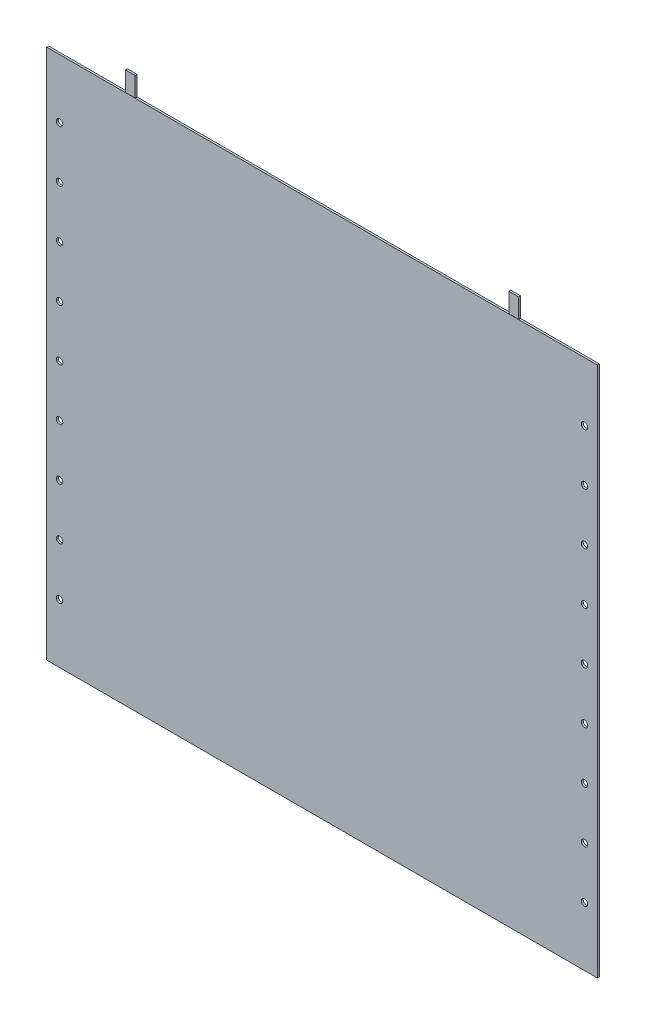
ISO-10303-21;
HEADER;
FILE_DESCRIPTION(('STEP AP214'),'2;1');
FILE_NAME('part.step','',(''),(''),'','','');
FILE_SCHEMA(('AUTOMOTIVE_DESIGN { 1 0 10303 214 1 1 1 1 }'));
ENDSEC;
DATA;
#1=APPLICATION_CONTEXT('core data for automotive mechanical design processes');
#2=APPLICATION_PROTOCOL_DEFINITION('international standard','automotive_design',2000,#1);
#3=PRODUCT_CONTEXT('',#1,'mechanical');
#4=PRODUCT('Part','Part','',(#3));
#5=PRODUCT_RELATED_PRODUCT_CATEGORY('part','',(#4));
#6=PRODUCT_DEFINITION_FORMATION('','',#4);
#7=PRODUCT_DEFINITION_CONTEXT('part definition',#1,'design');
#8=PRODUCT_DEFINITION('design','',#6,#7);
#9=PRODUCT_DEFINITION_SHAPE('','',#8);
#10=(LENGTH_UNIT() NAMED_UNIT(*) SI_UNIT(.MILLI.,.METRE.));
#11=(NAMED_UNIT(*) PLANE_ANGLE_UNIT() SI_UNIT($,.RADIAN.));
#12=(NAMED_UNIT(*) SI_UNIT($,.STERADIAN.) SOLID_ANGLE_UNIT());
#13=UNCERTAINTY_MEASURE_WITH_UNIT(LENGTH_MEASURE(1.E-05),#10,'distance_accuracy_value','');
#14=(GEOMETRIC_REPRESENTATION_CONTEXT(3) GLOBAL_UNCERTAINTY_ASSIGNED_CONTEXT((#13)) GLOBAL_UNIT_ASSIGNED_CONTEXT((#10,
#11,#12)) REPRESENTATION_CONTEXT('',''));
#15=CARTESIAN_POINT('',(0.,0.,0.));
#16=DIRECTION('',(0.,0.,1.));
#17=DIRECTION('',(1.,0.,0.));
#18=AXIS2_PLACEMENT_3D('',#15,#16,#17);
#19=CARTESIAN_POINT('',(0.,0.,1.));
#20=DIRECTION('',(0.,0.,1.));
#21=DIRECTION('',(1.,0.,0.));
#22=AXIS2_PLACEMENT_3D('',#19,#20,#21);
#23=PLANE('',#22);
#24=DIRECTION('',(-1.,0.,0.));
#25=VECTOR('',#24,1.);
#26=CARTESIAN_POINT('',(-100.,135.1,1.));
#27=LINE('',#26,#25);
#28=CARTESIAN_POINT('',(-95.,135.1,1.));
#29=VERTEX_POINT('',#28);
#30=CARTESIAN_POINT('',(-100.,135.1,1.));
#31=VERTEX_POINT('',#30);
#32=EDGE_CURVE('E321',#29,#31,#27,.T.);
#33=ORIENTED_EDGE('',*,*,#32,.F.);
#34=DIRECTION('',(0.,1.,0.));
#35=VECTOR('',#34,1.);
#36=CARTESIAN_POINT('',(-95.,135.,1.));
#37=LINE('',#36,#35);
#38=CARTESIAN_POINT('',(-95.,145.,1.));
#39=VERTEX_POINT('',#38);
#40=EDGE_CURVE('E292',#29,#39,#37,.T.);
#41=ORIENTED_EDGE('',*,*,#40,.T.);
#42=DIRECTION('',(-1.,0.,0.));
#43=VECTOR('',#42,1.);
#44=CARTESIAN_POINT('',(-100.,145.,1.));
#45=LINE('',#44,#43);
#46=CARTESIAN_POINT('',(-100.,145.,1.));
#47=VERTEX_POINT('',#46);
#48=EDGE_CURVE('E264',#39,#47,#45,.T.);
#49=ORIENTED_EDGE('',*,*,#48,.T.);
#50=DIRECTION('',(0.,-1.,0.));
#51=VECTOR('',#50,1.);
#52=CARTESIAN_POINT('',(-100.,135.,1.));
#53=LINE('',#52,#51);
#54=EDGE_CURVE('E248',#47,#31,#53,.T.);
#55=ORIENTED_EDGE('',*,*,#54,.T.);
#56=EDGE_LOOP('',(#33,#41,#49,#55));
#57=FACE_BOUND('',#56,.T.);
#58=ADVANCED_FACE('F35',(#57),#23,.T.);
#59=DIRECTION('',(-1.,0.,0.));
#60=VECTOR('',#59,1.);
#61=CARTESIAN_POINT('',(95.,135.1,1.));
#62=LINE('',#61,#60);
#63=CARTESIAN_POINT('',(100.,135.1,1.));
#64=VERTEX_POINT('',#63);
#65=CARTESIAN_POINT('',(95.,135.1,1.));
#66=VERTEX_POINT('',#65);
#67=EDGE_CURVE('E310',#64,#66,#62,.T.);
#68=ORIENTED_EDGE('',*,*,#67,.F.);
#69=DIRECTION('',(0.,1.,0.));
#70=VECTOR('',#69,1.);
#71=CARTESIAN_POINT('',(100.,135.,1.));
#72=LINE('',#71,#70);
#73=CARTESIAN_POINT('',(100.,145.,1.));
#74=VERTEX_POINT('',#73);
#75=EDGE_CURVE('E285',#64,#74,#72,.T.);
#76=ORIENTED_EDGE('',*,*,#75,.T.);
#77=DIRECTION('',(-1.,0.,0.));
#78=VECTOR('',#77,1.);
#79=CARTESIAN_POINT('',(95.,145.,1.));
#80=LINE('',#79,#78);
#81=CARTESIAN_POINT('',(95.,145.,1.));
#82=VERTEX_POINT('',#81);
#83=EDGE_CURVE('E287',#74,#82,#80,.T.);
#84=ORIENTED_EDGE('',*,*,#83,.T.);
#85=DIRECTION('',(0.,-1.,0.));
#86=VECTOR('',#85,1.);
#87=CARTESIAN_POINT('',(95.,135.,1.));
#88=LINE('',#87,#86);
#89=EDGE_CURVE('E289',#82,#66,#88,.T.);
#90=ORIENTED_EDGE('',*,*,#89,.T.);
#91=EDGE_LOOP('',(#68,#76,#84,#90));
#92=FACE_BOUND('',#91,.T.);
#93=ADVANCED_FACE('F309',(#92),#23,.T.);
#94=DIRECTION('',(-1.,0.,0.));
#95=VECTOR('',#94,1.);
#96=CARTESIAN_POINT('',(100.,135.,1.));
#97=LINE('',#96,#95);
#98=CARTESIAN_POINT('',(140.,135.,1.));
#99=VERTEX_POINT('',#98);
#100=CARTESIAN_POINT('',(-140.,135.,1.));
#101=VERTEX_POINT('',#100);
#102=EDGE_CURVE('E283',#99,#101,#97,.T.);
#103=ORIENTED_EDGE('',*,*,#102,.T.);
#104=DIRECTION('',(0.,-1.,0.));
#105=VECTOR('',#104,1.);
#106=CARTESIAN_POINT('',(-140.,135.,1.));
#107=LINE('',#106,#105);
#108=CARTESIAN_POINT('',(-140.,-135.,1.));
#109=VERTEX_POINT('',#108);
#110=EDGE_CURVE('E259',#101,#109,#107,.T.);
#111=ORIENTED_EDGE('',*,*,#110,.T.);
#112=DIRECTION('',(1.,0.,0.));
#113=VECTOR('',#112,1.);
#114=CARTESIAN_POINT('',(-140.,-135.,1.));
#115=LINE('',#114,#113);
#116=CARTESIAN_POINT('',(140.,-135.,1.));
#117=VERTEX_POINT('',#116);
#118=EDGE_CURVE('E232',#109,#117,#115,.T.);
#119=ORIENTED_EDGE('',*,*,#118,.T.);
#120=DIRECTION('',(0.,1.,0.));
#121=VECTOR('',#120,1.);
#122=CARTESIAN_POINT('',(140.,135.,1.));
#123=LINE('',#122,#121);
#124=EDGE_CURVE('E227',#117,#99,#123,.T.);
#125=ORIENTED_EDGE('',*,*,#124,.T.);
#126=EDGE_LOOP('',(#103,#111,#119,#125));
#127=FACE_BOUND('',#126,.T.);
#128=CARTESIAN_POINT('',(133.5,26.25,1.));
#129=DIRECTION('',(0.,0.,1.));
#130=DIRECTION('',(-1.,0.,0.));
#131=AXIS2_PLACEMENT_3D('',#128,#129,#130);
#132=CIRCLE('',#131,1.65000000000002);
#133=CARTESIAN_POINT('',(131.85,26.25,1.));
#134=VERTEX_POINT('',#133);
#135=EDGE_CURVE('E331',#134,#134,#132,.T.);
#136=ORIENTED_EDGE('',*,*,#135,.F.);
#137=EDGE_LOOP('',(#136));
#138=FACE_BOUND('',#137,.T.);
#139=CARTESIAN_POINT('',(133.5,78.75,1.));
#140=DIRECTION('',(0.,0.,1.));
#141=DIRECTION('',(-1.,0.,0.));
#142=AXIS2_PLACEMENT_3D('',#139,#140,#141);
#143=CIRCLE('',#142,1.65000000000002);
#144=CARTESIAN_POINT('',(131.85,78.75,1.));
#145=VERTEX_POINT('',#144);
#146=EDGE_CURVE('E343',#145,#145,#143,.T.);
#147=ORIENTED_EDGE('',*,*,#146,.F.);
#148=EDGE_LOOP('',(#147));
#149=FACE_BOUND('',#148,.T.);
#150=CARTESIAN_POINT('',(133.5,-26.25,1.));
#151=DIRECTION('',(0.,0.,1.));
#152=DIRECTION('',(-1.,0.,0.));
#153=AXIS2_PLACEMENT_3D('',#150,#151,#152);
#154=CIRCLE('',#153,1.65000000000002);
#155=CARTESIAN_POINT('',(131.85,-26.25,1.));
#156=VERTEX_POINT('',#155);
#157=EDGE_CURVE('E355',#156,#156,#154,.T.);
#158=ORIENTED_EDGE('',*,*,#157,.F.);
#159=EDGE_LOOP('',(#158));
#160=FACE_BOUND('',#159,.T.);
#161=CARTESIAN_POINT('',(133.499999999999,-78.75,1.));
#162=DIRECTION('',(0.,0.,1.));
#163=DIRECTION('',(-1.,0.,0.));
#164=AXIS2_PLACEMENT_3D('',#161,#162,#163);
#165=CIRCLE('',#164,1.65000000000002);
#166=CARTESIAN_POINT('',(131.849999999999,-78.75,1.));
#167=VERTEX_POINT('',#166);
#168=EDGE_CURVE('E367',#167,#167,#165,.T.);
#169=ORIENTED_EDGE('',*,*,#168,.F.);
#170=EDGE_LOOP('',(#169));
#171=FACE_BOUND('',#170,.T.);
#172=CARTESIAN_POINT('',(-133.499999999999,-78.75,1.));
#173=DIRECTION('',(0.,0.,1.));
#174=DIRECTION('',(1.,0.,0.));
#175=AXIS2_PLACEMENT_3D('',#172,#173,#174);
#176=CIRCLE('',#175,1.65000000000002);
#177=CARTESIAN_POINT('',(-131.849999999999,-78.75,1.));
#178=VERTEX_POINT('',#177);
#179=EDGE_CURVE('E379',#178,#178,#176,.T.);
#180=ORIENTED_EDGE('',*,*,#179,.F.);
#181=EDGE_LOOP('',(#180));
#182=FACE_BOUND('',#181,.T.);
#183=CARTESIAN_POINT('',(-133.5,-26.25,1.));
#184=DIRECTION('',(0.,0.,1.));
#185=DIRECTION('',(1.,0.,0.));
#186=AXIS2_PLACEMENT_3D('',#183,#184,#185);
#187=CIRCLE('',#186,1.65000000000002);
#188=CARTESIAN_POINT('',(-131.85,-26.25,1.));
#189=VERTEX_POINT('',#188);
#190=EDGE_CURVE('E391',#189,#189,#187,.T.);
#191=ORIENTED_EDGE('',*,*,#190,.F.);
#192=EDGE_LOOP('',(#191));
#193=FACE_BOUND('',#192,.T.);
#194=CARTESIAN_POINT('',(-133.5,78.75,1.));
#195=DIRECTION('',(0.,0.,1.));
#196=DIRECTION('',(1.,0.,0.));
#197=AXIS2_PLACEMENT_3D('',#194,#195,#196);
#198=CIRCLE('',#197,1.65000000000002);
#199=CARTESIAN_POINT('',(-131.85,78.75,1.));
#200=VERTEX_POINT('',#199);
#201=EDGE_CURVE('E403',#200,#200,#198,.T.);
#202=ORIENTED_EDGE('',*,*,#201,.F.);
#203=EDGE_LOOP('',(#202));
#204=FACE_BOUND('',#203,.T.);
#205=CARTESIAN_POINT('',(-133.5,26.25,1.));
#206=DIRECTION('',(0.,0.,1.));
#207=DIRECTION('',(1.,0.,0.));
#208=AXIS2_PLACEMENT_3D('',#205,#206,#207);
#209=CIRCLE('',#208,1.65000000000002);
#210=CARTESIAN_POINT('',(-131.85,26.25,1.));
#211=VERTEX_POINT('',#210);
#212=EDGE_CURVE('E415',#211,#211,#209,.T.);
#213=ORIENTED_EDGE('',*,*,#212,.F.);
#214=EDGE_LOOP('',(#213));
#215=FACE_BOUND('',#214,.T.);
#216=CARTESIAN_POINT('',(133.499999999999,-105.,1.));
#217=DIRECTION('',(0.,0.,1.));
#218=DIRECTION('',(-1.,0.,0.));
#219=AXIS2_PLACEMENT_3D('',#216,#217,#218);
#220=CIRCLE('',#219,1.65000000000002);
#221=CARTESIAN_POINT('',(131.849999999999,-105.,1.));
#222=VERTEX_POINT('',#221);
#223=EDGE_CURVE('E267',#222,#222,#220,.T.);
#224=ORIENTED_EDGE('',*,*,#223,.F.);
#225=EDGE_LOOP('',(#224));
#226=FACE_BOUND('',#225,.T.);
#227=CARTESIAN_POINT('',(-133.5,0.,1.));
#228=DIRECTION('',(0.,0.,1.));
#229=DIRECTION('',(1.,0.,0.));
#230=AXIS2_PLACEMENT_3D('',#227,#228,#229);
#231=CIRCLE('',#230,1.65000000000002);
#232=CARTESIAN_POINT('',(-131.85,0.,1.));
#233=VERTEX_POINT('',#232);
#234=EDGE_CURVE('E275',#233,#233,#231,.T.);
#235=ORIENTED_EDGE('',*,*,#234,.F.);
#236=EDGE_LOOP('',(#235));
#237=FACE_BOUND('',#236,.T.);
#238=CARTESIAN_POINT('',(-133.5,52.5,1.));
#239=DIRECTION('',(0.,0.,1.));
#240=DIRECTION('',(1.,0.,0.));
#241=AXIS2_PLACEMENT_3D('',#238,#239,#240);
#242=CIRCLE('',#241,1.65000000000002);
#243=CARTESIAN_POINT('',(-131.85,52.5,1.));
#244=VERTEX_POINT('',#243);
#245=EDGE_CURVE('E409',#244,#244,#242,.T.);
#246=ORIENTED_EDGE('',*,*,#245,.F.);
#247=EDGE_LOOP('',(#246));
#248=FACE_BOUND('',#247,.T.);
#249=CARTESIAN_POINT('',(-133.5,105.,1.));
#250=DIRECTION('',(0.,0.,1.));
#251=DIRECTION('',(1.,0.,0.));
#252=AXIS2_PLACEMENT_3D('',#249,#250,#251);
#253=CIRCLE('',#252,1.65000000000002);
#254=CARTESIAN_POINT('',(-131.85,105.,1.));
#255=VERTEX_POINT('',#254);
#256=EDGE_CURVE('E397',#255,#255,#253,.T.);
#257=ORIENTED_EDGE('',*,*,#256,.F.);
#258=EDGE_LOOP('',(#257));
#259=FACE_BOUND('',#258,.T.);
#260=CARTESIAN_POINT('',(-133.499999999999,-52.5,1.));
#261=DIRECTION('',(0.,0.,1.));
#262=DIRECTION('',(1.,0.,0.));
#263=AXIS2_PLACEMENT_3D('',#260,#261,#262);
#264=CIRCLE('',#263,1.65000000000002);
#265=CARTESIAN_POINT('',(-131.849999999999,-52.5,1.));
#266=VERTEX_POINT('',#265);
#267=EDGE_CURVE('E385',#266,#266,#264,.T.);
#268=ORIENTED_EDGE('',*,*,#267,.F.);
#269=EDGE_LOOP('',(#268));
#270=FACE_BOUND('',#269,.T.);
#271=CARTESIAN_POINT('',(-133.499999999999,-105.,1.));
#272=DIRECTION('',(0.,0.,1.));
#273=DIRECTION('',(1.,0.,0.));
#274=AXIS2_PLACEMENT_3D('',#271,#272,#273);
#275=CIRCLE('',#274,1.65000000000002);
#276=CARTESIAN_POINT('',(-131.849999999999,-105.,1.));
#277=VERTEX_POINT('',#276);
#278=EDGE_CURVE('E373',#277,#277,#275,.T.);
#279=ORIENTED_EDGE('',*,*,#278,.F.);
#280=EDGE_LOOP('',(#279));
#281=FACE_BOUND('',#280,.T.);
#282=CARTESIAN_POINT('',(133.499999999999,-52.5,1.));
#283=DIRECTION('',(0.,0.,1.));
#284=DIRECTION('',(-1.,0.,0.));
#285=AXIS2_PLACEMENT_3D('',#282,#283,#284);
#286=CIRCLE('',#285,1.65000000000002);
#287=CARTESIAN_POINT('',(131.849999999999,-52.5,1.));
#288=VERTEX_POINT('',#287);
#289=EDGE_CURVE('E361',#288,#288,#286,.T.);
#290=ORIENTED_EDGE('',*,*,#289,.F.);
#291=EDGE_LOOP('',(#290));
#292=FACE_BOUND('',#291,.T.);
#293=CARTESIAN_POINT('',(133.5,105.,1.));
#294=DIRECTION('',(0.,0.,1.));
#295=DIRECTION('',(-1.,0.,0.));
#296=AXIS2_PLACEMENT_3D('',#293,#294,#295);
#297=CIRCLE('',#296,1.65000000000002);
#298=CARTESIAN_POINT('',(131.85,105.,1.));
#299=VERTEX_POINT('',#298);
#300=EDGE_CURVE('E349',#299,#299,#297,.T.);
#301=ORIENTED_EDGE('',*,*,#300,.F.);
#302=EDGE_LOOP('',(#301));
#303=FACE_BOUND('',#302,.T.);
#304=CARTESIAN_POINT('',(133.5,52.5,1.));
#305=DIRECTION('',(0.,0.,1.));
#306=DIRECTION('',(-1.,0.,0.));
#307=AXIS2_PLACEMENT_3D('',#304,#305,#306);
#308=CIRCLE('',#307,1.65000000000002);
#309=CARTESIAN_POINT('',(131.85,52.5,1.));
#310=VERTEX_POINT('',#309);
#311=EDGE_CURVE('E337',#310,#310,#308,.T.);
#312=ORIENTED_EDGE('',*,*,#311,.F.);
#313=EDGE_LOOP('',(#312));
#314=FACE_BOUND('',#313,.T.);
#315=CARTESIAN_POINT('',(133.5,0.,1.));
#316=DIRECTION('',(0.,0.,1.));
#317=DIRECTION('',(-1.,0.,0.));
#318=AXIS2_PLACEMENT_3D('',#315,#316,#317);
#319=CIRCLE('',#318,1.65000000000002);
#320=CARTESIAN_POINT('',(131.85,0.,1.));
#321=VERTEX_POINT('',#320);
#322=EDGE_CURVE('E323',#321,#321,#319,.T.);
#323=ORIENTED_EDGE('',*,*,#322,.F.);
#324=EDGE_LOOP('',(#323));
#325=FACE_BOUND('',#324,.T.);
#326=ADVANCED_FACE('F443',(#127,#138,#149,#160,#171,#182,#193,#204,#215,#226,#237,#248,#259,
#270,#281,#292,#303,#314,#325),#23,.T.);
#327=CARTESIAN_POINT('',(0.,0.,0.));
#328=DIRECTION('',(0.,0.,1.));
#329=DIRECTION('',(1.,0.,0.));
#330=AXIS2_PLACEMENT_3D('',#327,#328,#329);
#331=PLANE('',#330);
#332=DIRECTION('',(0.,1.,0.));
#333=VECTOR('',#332,1.);
#334=CARTESIAN_POINT('',(140.,135.,0.));
#335=LINE('',#334,#333);
#336=CARTESIAN_POINT('',(140.,-135.,0.));
#337=VERTEX_POINT('',#336);
#338=CARTESIAN_POINT('',(140.,135.,0.));
#339=VERTEX_POINT('',#338);
#340=EDGE_CURVE('E199',#337,#339,#335,.T.);
#341=ORIENTED_EDGE('',*,*,#340,.F.);
#342=DIRECTION('',(1.,0.,0.));
#343=VECTOR('',#342,1.);
#344=CARTESIAN_POINT('',(-140.,-135.,0.));
#345=LINE('',#344,#343);
#346=CARTESIAN_POINT('',(-140.,-135.,0.));
#347=VERTEX_POINT('',#346);
#348=EDGE_CURVE('E225',#347,#337,#345,.T.);
#349=ORIENTED_EDGE('',*,*,#348,.F.);
#350=DIRECTION('',(0.,-1.,0.));
#351=VECTOR('',#350,1.);
#352=CARTESIAN_POINT('',(-140.,135.,0.));
#353=LINE('',#352,#351);
#354=CARTESIAN_POINT('',(-140.,135.,0.));
#355=VERTEX_POINT('',#354);
#356=EDGE_CURVE('E223',#355,#347,#353,.T.);
#357=ORIENTED_EDGE('',*,*,#356,.F.);
#358=DIRECTION('',(-1.,0.,0.));
#359=VECTOR('',#358,1.);
#360=CARTESIAN_POINT('',(-140.,135.,0.));
#361=LINE('',#360,#359);
#362=CARTESIAN_POINT('',(-100.,135.,0.));
#363=VERTEX_POINT('',#362);
#364=EDGE_CURVE('E221',#363,#355,#361,.T.);
#365=ORIENTED_EDGE('',*,*,#364,.F.);
#366=DIRECTION('',(0.,-1.,0.));
#367=VECTOR('',#366,1.);
#368=CARTESIAN_POINT('',(-100.,135.,0.));
#369=LINE('',#368,#367);
#370=CARTESIAN_POINT('',(-100.,145.,0.));
#371=VERTEX_POINT('',#370);
#372=EDGE_CURVE('E218',#371,#363,#369,.T.);
#373=ORIENTED_EDGE('',*,*,#372,.F.);
#374=DIRECTION('',(-1.,0.,0.));
#375=VECTOR('',#374,1.);
#376=CARTESIAN_POINT('',(-100.,145.,0.));
#377=LINE('',#376,#375);
#378=CARTESIAN_POINT('',(-95.,145.,0.));
#379=VERTEX_POINT('',#378);
#380=EDGE_CURVE('E216',#379,#371,#377,.T.);
#381=ORIENTED_EDGE('',*,*,#380,.F.);
#382=DIRECTION('',(0.,1.,0.));
#383=VECTOR('',#382,1.);
#384=CARTESIAN_POINT('',(-95.,135.,0.));
#385=LINE('',#384,#383);
#386=CARTESIAN_POINT('',(-95.,135.,0.));
#387=VERTEX_POINT('',#386);
#388=EDGE_CURVE('E214',#387,#379,#385,.T.);
#389=ORIENTED_EDGE('',*,*,#388,.F.);
#390=DIRECTION('',(-1.,0.,0.));
#391=VECTOR('',#390,1.);
#392=CARTESIAN_POINT('',(-95.,135.,0.));
#393=LINE('',#392,#391);
#394=CARTESIAN_POINT('',(95.,135.,0.));
#395=VERTEX_POINT('',#394);
#396=EDGE_CURVE('E167',#395,#387,#393,.T.);
#397=ORIENTED_EDGE('',*,*,#396,.F.);
#398=DIRECTION('',(0.,-1.,0.));
#399=VECTOR('',#398,1.);
#400=CARTESIAN_POINT('',(95.,135.,0.));
#401=LINE('',#400,#399);
#402=CARTESIAN_POINT('',(95.,145.,0.));
#403=VERTEX_POINT('',#402);
#404=EDGE_CURVE('E207',#403,#395,#401,.T.);
#405=ORIENTED_EDGE('',*,*,#404,.F.);
#406=DIRECTION('',(-1.,0.,0.));
#407=VECTOR('',#406,1.);
#408=CARTESIAN_POINT('',(95.,145.,0.));
#409=LINE('',#408,#407);
#410=CARTESIAN_POINT('',(100.,145.,0.));
#411=VERTEX_POINT('',#410);
#412=EDGE_CURVE('E205',#411,#403,#409,.T.);
#413=ORIENTED_EDGE('',*,*,#412,.F.);
#414=DIRECTION('',(0.,1.,0.));
#415=VECTOR('',#414,1.);
#416=CARTESIAN_POINT('',(100.,135.,0.));
#417=LINE('',#416,#415);
#418=CARTESIAN_POINT('',(100.,135.,0.));
#419=VERTEX_POINT('',#418);
#420=EDGE_CURVE('E191',#419,#411,#417,.T.);
#421=ORIENTED_EDGE('',*,*,#420,.F.);
#422=DIRECTION('',(-1.,0.,0.));
#423=VECTOR('',#422,1.);
#424=CARTESIAN_POINT('',(100.,135.,0.));
#425=LINE('',#424,#423);
#426=EDGE_CURVE('E194',#339,#419,#425,.T.);
#427=ORIENTED_EDGE('',*,*,#426,.F.);
#428=EDGE_LOOP('',(#341,#349,#357,#365,#373,#381,#389,#397,#405,#413,#421,#427));
#429=FACE_BOUND('',#428,.T.);
#430=CARTESIAN_POINT('',(133.499999999999,-105.,0.));
#431=DIRECTION('',(0.,0.,1.));
#432=DIRECTION('',(-1.,0.,0.));
#433=AXIS2_PLACEMENT_3D('',#430,#431,#432);
#434=CIRCLE('',#433,1.65000000000002);
#435=CARTESIAN_POINT('',(131.849999999999,-105.,0.));
#436=VERTEX_POINT('',#435);
#437=EDGE_CURVE('E270',#436,#436,#434,.T.);
#438=ORIENTED_EDGE('',*,*,#437,.T.);
#439=EDGE_LOOP('',(#438));
#440=FACE_BOUND('',#439,.T.);
#441=CARTESIAN_POINT('',(-133.5,0.,0.));
#442=DIRECTION('',(0.,0.,1.));
#443=DIRECTION('',(1.,0.,0.));
#444=AXIS2_PLACEMENT_3D('',#441,#442,#443);
#445=CIRCLE('',#444,1.65000000000002);
#446=CARTESIAN_POINT('',(-131.85,0.,0.));
#447=VERTEX_POINT('',#446);
#448=EDGE_CURVE('E278',#447,#447,#445,.T.);
#449=ORIENTED_EDGE('',*,*,#448,.T.);
#450=EDGE_LOOP('',(#449));
#451=FACE_BOUND('',#450,.T.);
#452=CARTESIAN_POINT('',(-133.5,26.25,0.));
#453=DIRECTION('',(0.,0.,1.));
#454=DIRECTION('',(1.,0.,0.));
#455=AXIS2_PLACEMENT_3D('',#452,#453,#454);
#456=CIRCLE('',#455,1.65000000000002);
#457=CARTESIAN_POINT('',(-131.85,26.25,0.));
#458=VERTEX_POINT('',#457);
#459=EDGE_CURVE('E412',#458,#458,#456,.T.);
#460=ORIENTED_EDGE('',*,*,#459,.T.);
#461=EDGE_LOOP('',(#460));
#462=FACE_BOUND('',#461,.T.);
#463=CARTESIAN_POINT('',(-133.5,52.5,0.));
#464=DIRECTION('',(0.,0.,1.));
#465=DIRECTION('',(1.,0.,0.));
#466=AXIS2_PLACEMENT_3D('',#463,#464,#465);
#467=CIRCLE('',#466,1.65000000000002);
#468=CARTESIAN_POINT('',(-131.85,52.5,0.));
#469=VERTEX_POINT('',#468);
#470=EDGE_CURVE('E406',#469,#469,#467,.T.);
#471=ORIENTED_EDGE('',*,*,#470,.T.);
#472=EDGE_LOOP('',(#471));
#473=FACE_BOUND('',#472,.T.);
#474=CARTESIAN_POINT('',(-133.5,78.75,0.));
#475=DIRECTION('',(0.,0.,1.));
#476=DIRECTION('',(1.,0.,0.));
#477=AXIS2_PLACEMENT_3D('',#474,#475,#476);
#478=CIRCLE('',#477,1.65000000000002);
#479=CARTESIAN_POINT('',(-131.85,78.75,0.));
#480=VERTEX_POINT('',#479);
#481=EDGE_CURVE('E400',#480,#480,#478,.T.);
#482=ORIENTED_EDGE('',*,*,#481,.T.);
#483=EDGE_LOOP('',(#482));
#484=FACE_BOUND('',#483,.T.);
#485=CARTESIAN_POINT('',(-133.5,105.,0.));
#486=DIRECTION('',(0.,0.,1.));
#487=DIRECTION('',(1.,0.,0.));
#488=AXIS2_PLACEMENT_3D('',#485,#486,#487);
#489=CIRCLE('',#488,1.65000000000002);
#490=CARTESIAN_POINT('',(-131.85,105.,0.));
#491=VERTEX_POINT('',#490);
#492=EDGE_CURVE('E394',#491,#491,#489,.T.);
#493=ORIENTED_EDGE('',*,*,#492,.T.);
#494=EDGE_LOOP('',(#493));
#495=FACE_BOUND('',#494,.T.);
#496=CARTESIAN_POINT('',(-133.5,-26.25,0.));
#497=DIRECTION('',(0.,0.,1.));
#498=DIRECTION('',(1.,0.,0.));
#499=AXIS2_PLACEMENT_3D('',#496,#497,#498);
#500=CIRCLE('',#499,1.65000000000002);
#501=CARTESIAN_POINT('',(-131.85,-26.25,0.));
#502=VERTEX_POINT('',#501);
#503=EDGE_CURVE('E388',#502,#502,#500,.T.);
#504=ORIENTED_EDGE('',*,*,#503,.T.);
#505=EDGE_LOOP('',(#504));
#506=FACE_BOUND('',#505,.T.);
#507=CARTESIAN_POINT('',(-133.499999999999,-52.5,0.));
#508=DIRECTION('',(0.,0.,1.));
#509=DIRECTION('',(1.,0.,0.));
#510=AXIS2_PLACEMENT_3D('',#507,#508,#509);
#511=CIRCLE('',#510,1.65000000000002);
#512=CARTESIAN_POINT('',(-131.849999999999,-52.5,0.));
#513=VERTEX_POINT('',#512);
#514=EDGE_CURVE('E382',#513,#513,#511,.T.);
#515=ORIENTED_EDGE('',*,*,#514,.T.);
#516=EDGE_LOOP('',(#515));
#517=FACE_BOUND('',#516,.T.);
#518=CARTESIAN_POINT('',(-133.499999999999,-78.75,0.));
#519=DIRECTION('',(0.,0.,1.));
#520=DIRECTION('',(1.,0.,0.));
#521=AXIS2_PLACEMENT_3D('',#518,#519,#520);
#522=CIRCLE('',#521,1.65000000000002);
#523=CARTESIAN_POINT('',(-131.849999999999,-78.75,0.));
#524=VERTEX_POINT('',#523);
#525=EDGE_CURVE('E376',#524,#524,#522,.T.);
#526=ORIENTED_EDGE('',*,*,#525,.T.);
#527=EDGE_LOOP('',(#526));
#528=FACE_BOUND('',#527,.T.);
#529=CARTESIAN_POINT('',(-133.499999999999,-105.,0.));
#530=DIRECTION('',(0.,0.,1.));
#531=DIRECTION('',(1.,0.,0.));
#532=AXIS2_PLACEMENT_3D('',#529,#530,#531);
#533=CIRCLE('',#532,1.65000000000002);
#534=CARTESIAN_POINT('',(-131.849999999999,-105.,0.));
#535=VERTEX_POINT('',#534);
#536=EDGE_CURVE('E370',#535,#535,#533,.T.);
#537=ORIENTED_EDGE('',*,*,#536,.T.);
#538=EDGE_LOOP('',(#537));
#539=FACE_BOUND('',#538,.T.);
#540=CARTESIAN_POINT('',(133.499999999999,-78.75,0.));
#541=DIRECTION('',(0.,0.,1.));
#542=DIRECTION('',(-1.,0.,0.));
#543=AXIS2_PLACEMENT_3D('',#540,#541,#542);
#544=CIRCLE('',#543,1.65000000000002);
#545=CARTESIAN_POINT('',(131.849999999999,-78.75,0.));
#546=VERTEX_POINT('',#545);
#547=EDGE_CURVE('E364',#546,#546,#544,.T.);
#548=ORIENTED_EDGE('',*,*,#547,.T.);
#549=EDGE_LOOP('',(#548));
#550=FACE_BOUND('',#549,.T.);
#551=CARTESIAN_POINT('',(133.499999999999,-52.5,0.));
#552=DIRECTION('',(0.,0.,1.));
#553=DIRECTION('',(-1.,0.,0.));
#554=AXIS2_PLACEMENT_3D('',#551,#552,#553);
#555=CIRCLE('',#554,1.65000000000002);
#556=CARTESIAN_POINT('',(131.849999999999,-52.5,0.));
#557=VERTEX_POINT('',#556);
#558=EDGE_CURVE('E358',#557,#557,#555,.T.);
#559=ORIENTED_EDGE('',*,*,#558,.T.);
#560=EDGE_LOOP('',(#559));
#561=FACE_BOUND('',#560,.T.);
#562=CARTESIAN_POINT('',(133.5,-26.25,0.));
#563=DIRECTION('',(0.,0.,1.));
#564=DIRECTION('',(-1.,0.,0.));
#565=AXIS2_PLACEMENT_3D('',#562,#563,#564);
#566=CIRCLE('',#565,1.65000000000002);
#567=CARTESIAN_POINT('',(131.85,-26.25,0.));
#568=VERTEX_POINT('',#567);
#569=EDGE_CURVE('E352',#568,#568,#566,.T.);
#570=ORIENTED_EDGE('',*,*,#569,.T.);
#571=EDGE_LOOP('',(#570));
#572=FACE_BOUND('',#571,.T.);
#573=CARTESIAN_POINT('',(133.5,105.,0.));
#574=DIRECTION('',(0.,0.,1.));
#575=DIRECTION('',(-1.,0.,0.));
#576=AXIS2_PLACEMENT_3D('',#573,#574,#575);
#577=CIRCLE('',#576,1.65000000000002);
#578=CARTESIAN_POINT('',(131.85,105.,0.));
#579=VERTEX_POINT('',#578);
#580=EDGE_CURVE('E346',#579,#579,#577,.T.);
#581=ORIENTED_EDGE('',*,*,#580,.T.);
#582=EDGE_LOOP('',(#581));
#583=FACE_BOUND('',#582,.T.);
#584=CARTESIAN_POINT('',(133.5,78.75,0.));
#585=DIRECTION('',(0.,0.,1.));
#586=DIRECTION('',(-1.,0.,0.));
#587=AXIS2_PLACEMENT_3D('',#584,#585,#586);
#588=CIRCLE('',#587,1.65000000000002);
#589=CARTESIAN_POINT('',(131.85,78.75,0.));
#590=VERTEX_POINT('',#589);
#591=EDGE_CURVE('E340',#590,#590,#588,.T.);
#592=ORIENTED_EDGE('',*,*,#591,.T.);
#593=EDGE_LOOP('',(#592));
#594=FACE_BOUND('',#593,.T.);
#595=CARTESIAN_POINT('',(133.5,52.5,0.));
#596=DIRECTION('',(0.,0.,1.));
#597=DIRECTION('',(-1.,0.,0.));
#598=AXIS2_PLACEMENT_3D('',#595,#596,#597);
#599=CIRCLE('',#598,1.65000000000002);
#600=CARTESIAN_POINT('',(131.85,52.5,0.));
#601=VERTEX_POINT('',#600);
#602=EDGE_CURVE('E334',#601,#601,#599,.T.);
#603=ORIENTED_EDGE('',*,*,#602,.T.);
#604=EDGE_LOOP('',(#603));
#605=FACE_BOUND('',#604,.T.);
#606=CARTESIAN_POINT('',(133.5,26.25,0.));
#607=DIRECTION('',(0.,0.,1.));
#608=DIRECTION('',(-1.,0.,0.));
#609=AXIS2_PLACEMENT_3D('',#606,#607,#608);
#610=CIRCLE('',#609,1.65000000000002);
#611=CARTESIAN_POINT('',(131.85,26.25,0.));
#612=VERTEX_POINT('',#611);
#613=EDGE_CURVE('E326',#612,#612,#610,.T.);
#614=ORIENTED_EDGE('',*,*,#613,.T.);
#615=EDGE_LOOP('',(#614));
#616=FACE_BOUND('',#615,.T.);
#617=CARTESIAN_POINT('',(133.5,0.,0.));
#618=DIRECTION('',(0.,0.,1.));
#619=DIRECTION('',(-1.,0.,0.));
#620=AXIS2_PLACEMENT_3D('',#617,#618,#619);
#621=CIRCLE('',#620,1.65000000000002);
#622=CARTESIAN_POINT('',(131.85,0.,0.));
#623=VERTEX_POINT('',#622);
#624=EDGE_CURVE('E327',#623,#623,#621,.T.);
#625=ORIENTED_EDGE('',*,*,#624,.T.);
#626=EDGE_LOOP('',(#625));
#627=FACE_BOUND('',#626,.T.);
#628=ADVANCED_FACE('F202',(#429,#440,#451,#462,#473,#484,#495,#506,#517,#528,#539,#550,#561,
#572,#583,#594,#605,#616,#627),#331,.F.);
#629=CARTESIAN_POINT('',(140.,135.,1.));
#630=DIRECTION('',(-1.,0.,0.));
#631=DIRECTION('',(0.,-1.,0.));
#632=AXIS2_PLACEMENT_3D('',#629,#630,#631);
#633=PLANE('',#632);
#634=ORIENTED_EDGE('',*,*,#340,.T.);
#635=DIRECTION('',(0.,0.,-1.));
#636=VECTOR('',#635,1.);
#637=CARTESIAN_POINT('',(140.,135.,1.));
#638=LINE('',#637,#636);
#639=EDGE_CURVE('E11',#99,#339,#638,.T.);
#640=ORIENTED_EDGE('',*,*,#639,.F.);
#641=ORIENTED_EDGE('',*,*,#124,.F.);
#642=DIRECTION('',(0.,0.,-1.));
#643=VECTOR('',#642,1.);
#644=CARTESIAN_POINT('',(140.,-135.,1.));
#645=LINE('',#644,#643);
#646=EDGE_CURVE('E228',#117,#337,#645,.T.);
#647=ORIENTED_EDGE('',*,*,#646,.T.);
#648=EDGE_LOOP('',(#634,#640,#641,#647));
#649=FACE_BOUND('',#648,.T.);
#650=ADVANCED_FACE('F37',(#649),#633,.F.);
#651=CARTESIAN_POINT('',(100.,135.,1.));
#652=DIRECTION('',(-1.,0.,0.));
#653=DIRECTION('',(0.,0.,1.));
#654=AXIS2_PLACEMENT_3D('',#651,#652,#653);
#655=PLANE('',#654);
#656=ORIENTED_EDGE('',*,*,#75,.F.);
#657=DIRECTION('',(0.,0.,1.));
#658=VECTOR('',#657,1.);
#659=CARTESIAN_POINT('',(100.,135.1,0.9));
#660=LINE('',#659,#658);
#661=CARTESIAN_POINT('',(100.,135.1,0.9));
#662=VERTEX_POINT('',#661);
#663=EDGE_CURVE('E306',#662,#64,#660,.T.);
#664=ORIENTED_EDGE('',*,*,#663,.F.);
#665=DIRECTION('',(0.,1.,0.));
#666=VECTOR('',#665,1.);
#667=CARTESIAN_POINT('',(100.,135.,0.9));
#668=LINE('',#667,#666);
#669=CARTESIAN_POINT('',(100.,135.,0.9));
#670=VERTEX_POINT('',#669);
#671=EDGE_CURVE('E193',#670,#662,#668,.T.);
#672=ORIENTED_EDGE('',*,*,#671,.F.);
#673=DIRECTION('',(0.,0.,-1.));
#674=VECTOR('',#673,1.);
#675=CARTESIAN_POINT('',(100.,135.,1.));
#676=LINE('',#675,#674);
#677=EDGE_CURVE('E43',#670,#419,#676,.T.);
#678=ORIENTED_EDGE('',*,*,#677,.T.);
#679=ORIENTED_EDGE('',*,*,#420,.T.);
#680=DIRECTION('',(0.,0.,-1.));
#681=VECTOR('',#680,1.);
#682=CARTESIAN_POINT('',(100.,145.,1.));
#683=LINE('',#682,#681);
#684=EDGE_CURVE('E181',#74,#411,#683,.T.);
#685=ORIENTED_EDGE('',*,*,#684,.F.);
#686=EDGE_LOOP('',(#656,#664,#672,#678,#679,#685));
#687=FACE_BOUND('',#686,.T.);
#688=ADVANCED_FACE('F188',(#687),#655,.F.);
#689=CARTESIAN_POINT('',(95.,145.,1.));
#690=DIRECTION('',(0.,-1.,0.));
#691=DIRECTION('',(0.,0.,-1.));
#692=AXIS2_PLACEMENT_3D('',#689,#690,#691);
#693=PLANE('',#692);
#694=ORIENTED_EDGE('',*,*,#412,.T.);
#695=DIRECTION('',(0.,0.,-1.));
#696=VECTOR('',#695,1.);
#697=CARTESIAN_POINT('',(95.,145.,1.));
#698=LINE('',#697,#696);
#699=EDGE_CURVE('E172',#82,#403,#698,.T.);
#700=ORIENTED_EDGE('',*,*,#699,.F.);
#701=ORIENTED_EDGE('',*,*,#83,.F.);
#702=ORIENTED_EDGE('',*,*,#684,.T.);
#703=EDGE_LOOP('',(#694,#700,#701,#702));
#704=FACE_BOUND('',#703,.T.);
#705=ADVANCED_FACE('F305',(#704),#693,.F.);
#706=CARTESIAN_POINT('',(95.,135.,1.));
#707=DIRECTION('',(1.,0.,0.));
#708=DIRECTION('',(0.,0.,-1.));
#709=AXIS2_PLACEMENT_3D('',#706,#707,#708);
#710=PLANE('',#709);
#711=DIRECTION('',(0.,-1.,0.));
#712=VECTOR('',#711,1.);
#713=CARTESIAN_POINT('',(95.,135.,0.9));
#714=LINE('',#713,#712);
#715=CARTESIAN_POINT('',(95.,135.1,0.9));
#716=VERTEX_POINT('',#715);
#717=CARTESIAN_POINT('',(95.,135.,0.9));
#718=VERTEX_POINT('',#717);
#719=EDGE_CURVE('E50',#716,#718,#714,.T.);
#720=ORIENTED_EDGE('',*,*,#719,.F.);
#721=DIRECTION('',(0.,0.,1.));
#722=VECTOR('',#721,1.);
#723=CARTESIAN_POINT('',(95.,135.1,0.9));
#724=LINE('',#723,#722);
#725=EDGE_CURVE('E319',#716,#66,#724,.T.);
#726=ORIENTED_EDGE('',*,*,#725,.T.);
#727=ORIENTED_EDGE('',*,*,#89,.F.);
#728=ORIENTED_EDGE('',*,*,#699,.T.);
#729=ORIENTED_EDGE('',*,*,#404,.T.);
#730=DIRECTION('',(0.,0.,-1.));
#731=VECTOR('',#730,1.);
#732=CARTESIAN_POINT('',(95.,135.,1.));
#733=LINE('',#732,#731);
#734=EDGE_CURVE('E169',#718,#395,#733,.T.);
#735=ORIENTED_EDGE('',*,*,#734,.F.);
#736=EDGE_LOOP('',(#720,#726,#727,#728,#729,#735));
#737=FACE_BOUND('',#736,.T.);
#738=ADVANCED_FACE('F299',(#737),#710,.F.);
#739=CARTESIAN_POINT('',(-95.,135.,1.));
#740=DIRECTION('',(-1.,0.,0.));
#741=DIRECTION('',(0.,0.,1.));
#742=AXIS2_PLACEMENT_3D('',#739,#740,#741);
#743=PLANE('',#742);
#744=ORIENTED_EDGE('',*,*,#40,.F.);
#745=DIRECTION('',(0.,0.,1.));
#746=VECTOR('',#745,1.);
#747=CARTESIAN_POINT('',(-95.,135.1,0.9));
#748=LINE('',#747,#746);
#749=CARTESIAN_POINT('',(-95.,135.1,0.9));
#750=VERTEX_POINT('',#749);
#751=EDGE_CURVE('E162',#750,#29,#748,.T.);
#752=ORIENTED_EDGE('',*,*,#751,.F.);
#753=DIRECTION('',(0.,1.,0.));
#754=VECTOR('',#753,1.);
#755=CARTESIAN_POINT('',(-95.,135.,0.9));
#756=LINE('',#755,#754);
#757=CARTESIAN_POINT('',(-95.,135.,0.9));
#758=VERTEX_POINT('',#757);
#759=EDGE_CURVE('E150',#758,#750,#756,.T.);
#760=ORIENTED_EDGE('',*,*,#759,.F.);
#761=DIRECTION('',(0.,0.,-1.));
#762=VECTOR('',#761,1.);
#763=CARTESIAN_POINT('',(-95.,135.,1.));
#764=LINE('',#763,#762);
#765=EDGE_CURVE('E160',#758,#387,#764,.T.);
#766=ORIENTED_EDGE('',*,*,#765,.T.);
#767=ORIENTED_EDGE('',*,*,#388,.T.);
#768=DIRECTION('',(0.,0.,-1.));
#769=VECTOR('',#768,1.);
#770=CARTESIAN_POINT('',(-95.,145.,1.));
#771=LINE('',#770,#769);
#772=EDGE_CURVE('E170',#39,#379,#771,.T.);
#773=ORIENTED_EDGE('',*,*,#772,.F.);
#774=EDGE_LOOP('',(#744,#752,#760,#766,#767,#773));
#775=FACE_BOUND('',#774,.T.);
#776=ADVANCED_FACE('F159',(#775),#743,.F.);
#777=CARTESIAN_POINT('',(-100.,145.,1.));
#778=DIRECTION('',(0.,-1.,0.));
#779=DIRECTION('',(0.,0.,-1.));
#780=AXIS2_PLACEMENT_3D('',#777,#778,#779);
#781=PLANE('',#780);
#782=ORIENTED_EDGE('',*,*,#380,.T.);
#783=DIRECTION('',(0.,0.,-1.));
#784=VECTOR('',#783,1.);
#785=CARTESIAN_POINT('',(-100.,145.,1.));
#786=LINE('',#785,#784);
#787=EDGE_CURVE('E175',#47,#371,#786,.T.);
#788=ORIENTED_EDGE('',*,*,#787,.F.);
#789=ORIENTED_EDGE('',*,*,#48,.F.);
#790=ORIENTED_EDGE('',*,*,#772,.T.);
#791=EDGE_LOOP('',(#782,#788,#789,#790));
#792=FACE_BOUND('',#791,.T.);
#793=ADVANCED_FACE('F296',(#792),#781,.F.);
#794=CARTESIAN_POINT('',(-100.,135.,1.));
#795=DIRECTION('',(1.,0.,0.));
#796=DIRECTION('',(0.,0.,-1.));
#797=AXIS2_PLACEMENT_3D('',#794,#795,#796);
#798=PLANE('',#797);
#799=DIRECTION('',(0.,-1.,0.));
#800=VECTOR('',#799,1.);
#801=CARTESIAN_POINT('',(-100.,135.,0.9));
#802=LINE('',#801,#800);
#803=CARTESIAN_POINT('',(-100.,135.1,0.9));
#804=VERTEX_POINT('',#803);
#805=CARTESIAN_POINT('',(-100.,135.,0.9));
#806=VERTEX_POINT('',#805);
#807=EDGE_CURVE('E58',#804,#806,#802,.T.);
#808=ORIENTED_EDGE('',*,*,#807,.F.);
#809=DIRECTION('',(0.,0.,1.));
#810=VECTOR('',#809,1.);
#811=CARTESIAN_POINT('',(-100.,135.1,0.9));
#812=LINE('',#811,#810);
#813=EDGE_CURVE('E330',#804,#31,#812,.T.);
#814=ORIENTED_EDGE('',*,*,#813,.T.);
#815=ORIENTED_EDGE('',*,*,#54,.F.);
#816=ORIENTED_EDGE('',*,*,#787,.T.);
#817=ORIENTED_EDGE('',*,*,#372,.T.);
#818=DIRECTION('',(0.,0.,-1.));
#819=VECTOR('',#818,1.);
#820=CARTESIAN_POINT('',(-100.,135.,1.));
#821=LINE('',#820,#819);
#822=EDGE_CURVE('E238',#806,#363,#821,.T.);
#823=ORIENTED_EDGE('',*,*,#822,.F.);
#824=EDGE_LOOP('',(#808,#814,#815,#816,#817,#823));
#825=FACE_BOUND('',#824,.T.);
#826=ADVANCED_FACE('F244',(#825),#798,.F.);
#827=CARTESIAN_POINT('',(-140.,135.,1.));
#828=DIRECTION('',(0.,-1.,0.));
#829=DIRECTION('',(0.,0.,-1.));
#830=AXIS2_PLACEMENT_3D('',#827,#828,#829);
#831=PLANE('',#830);
#832=ORIENTED_EDGE('',*,*,#364,.T.);
#833=DIRECTION('',(0.,0.,-1.));
#834=VECTOR('',#833,1.);
#835=CARTESIAN_POINT('',(-140.,135.,1.));
#836=LINE('',#835,#834);
#837=EDGE_CURVE('E235',#101,#355,#836,.T.);
#838=ORIENTED_EDGE('',*,*,#837,.F.);
#839=ORIENTED_EDGE('',*,*,#102,.F.);
#840=ORIENTED_EDGE('',*,*,#639,.T.);
#841=ORIENTED_EDGE('',*,*,#426,.T.);
#842=ORIENTED_EDGE('',*,*,#677,.F.);
#843=DIRECTION('',(1.,0.,0.));
#844=VECTOR('',#843,1.);
#845=CARTESIAN_POINT('',(95.,135.,0.9));
#846=LINE('',#845,#844);
#847=EDGE_CURVE('E313',#718,#670,#846,.T.);
#848=ORIENTED_EDGE('',*,*,#847,.F.);
#849=ORIENTED_EDGE('',*,*,#734,.T.);
#850=ORIENTED_EDGE('',*,*,#396,.T.);
#851=ORIENTED_EDGE('',*,*,#765,.F.);
#852=DIRECTION('',(1.,0.,0.));
#853=VECTOR('',#852,1.);
#854=CARTESIAN_POINT('',(-100.,135.,0.9));
#855=LINE('',#854,#853);
#856=EDGE_CURVE('E147',#806,#758,#855,.T.);
#857=ORIENTED_EDGE('',*,*,#856,.F.);
#858=ORIENTED_EDGE('',*,*,#822,.T.);
#859=EDGE_LOOP('',(#832,#838,#839,#840,#841,#842,#848,#849,#850,#851,#857,#858));
#860=FACE_BOUND('',#859,.T.);
#861=ADVANCED_FACE('F165',(#860),#831,.F.);
#862=CARTESIAN_POINT('',(-140.,135.,1.));
#863=DIRECTION('',(1.,0.,0.));
#864=DIRECTION('',(0.,1.,0.));
#865=AXIS2_PLACEMENT_3D('',#862,#863,#864);
#866=PLANE('',#865);
#867=ORIENTED_EDGE('',*,*,#356,.T.);
#868=DIRECTION('',(0.,0.,-1.));
#869=VECTOR('',#868,1.);
#870=CARTESIAN_POINT('',(-140.,-135.,1.));
#871=LINE('',#870,#869);
#872=EDGE_CURVE('E231',#109,#347,#871,.T.);
#873=ORIENTED_EDGE('',*,*,#872,.F.);
#874=ORIENTED_EDGE('',*,*,#110,.F.);
#875=ORIENTED_EDGE('',*,*,#837,.T.);
#876=EDGE_LOOP('',(#867,#873,#874,#875));
#877=FACE_BOUND('',#876,.T.);
#878=ADVANCED_FACE('F257',(#877),#866,.F.);
#879=CARTESIAN_POINT('',(-140.,-135.,1.));
#880=DIRECTION('',(0.,1.,0.));
#881=DIRECTION('',(-1.,0.,0.));
#882=AXIS2_PLACEMENT_3D('',#879,#880,#881);
#883=PLANE('',#882);
#884=ORIENTED_EDGE('',*,*,#348,.T.);
#885=ORIENTED_EDGE('',*,*,#646,.F.);
#886=ORIENTED_EDGE('',*,*,#118,.F.);
#887=ORIENTED_EDGE('',*,*,#872,.T.);
#888=EDGE_LOOP('',(#884,#885,#886,#887));
#889=FACE_BOUND('',#888,.T.);
#890=ADVANCED_FACE('F439',(#889),#883,.F.);
#891=CARTESIAN_POINT('',(133.499999999999,-105.,1.));
#892=DIRECTION('',(0.,0.,-1.));
#893=DIRECTION('',(-1.,0.,0.));
#894=AXIS2_PLACEMENT_3D('',#891,#892,#893);
#895=CYLINDRICAL_SURFACE('',#894,1.65000000000002);
#896=ORIENTED_EDGE('',*,*,#223,.T.);
#897=EDGE_LOOP('',(#896));
#898=FACE_BOUND('',#897,.T.);
#899=ORIENTED_EDGE('',*,*,#437,.F.);
#900=EDGE_LOOP('',(#899));
#901=FACE_BOUND('',#900,.T.);
#902=ADVANCED_FACE('F430',(#898,#901),#895,.F.);
#903=CARTESIAN_POINT('',(-133.5,0.,1.));
#904=DIRECTION('',(0.,0.,-1.));
#905=DIRECTION('',(-1.,0.,0.));
#906=AXIS2_PLACEMENT_3D('',#903,#904,#905);
#907=CYLINDRICAL_SURFACE('',#906,1.65000000000002);
#908=ORIENTED_EDGE('',*,*,#234,.T.);
#909=EDGE_LOOP('',(#908));
#910=FACE_BOUND('',#909,.T.);
#911=ORIENTED_EDGE('',*,*,#448,.F.);
#912=EDGE_LOOP('',(#911));
#913=FACE_BOUND('',#912,.T.);
#914=ADVANCED_FACE('F427',(#910,#913),#907,.F.);
#915=CARTESIAN_POINT('',(-133.5,26.25,1.));
#916=DIRECTION('',(0.,0.,-1.));
#917=DIRECTION('',(-1.,0.,0.));
#918=AXIS2_PLACEMENT_3D('',#915,#916,#917);
#919=CYLINDRICAL_SURFACE('',#918,1.65000000000002);
#920=ORIENTED_EDGE('',*,*,#212,.T.);
#921=EDGE_LOOP('',(#920));
#922=FACE_BOUND('',#921,.T.);
#923=ORIENTED_EDGE('',*,*,#459,.F.);
#924=EDGE_LOOP('',(#923));
#925=FACE_BOUND('',#924,.T.);
#926=ADVANCED_FACE('F429',(#922,#925),#919,.F.);
#927=CARTESIAN_POINT('',(-133.5,52.5,1.));
#928=DIRECTION('',(0.,0.,-1.));
#929=DIRECTION('',(-1.,0.,0.));
#930=AXIS2_PLACEMENT_3D('',#927,#928,#929);
#931=CYLINDRICAL_SURFACE('',#930,1.65000000000002);
#932=ORIENTED_EDGE('',*,*,#245,.T.);
#933=EDGE_LOOP('',(#932));
#934=FACE_BOUND('',#933,.T.);
#935=ORIENTED_EDGE('',*,*,#470,.F.);
#936=EDGE_LOOP('',(#935));
#937=FACE_BOUND('',#936,.T.);
#938=ADVANCED_FACE('F436',(#934,#937),#931,.F.);
#939=CARTESIAN_POINT('',(-133.5,78.75,1.));
#940=DIRECTION('',(0.,0.,-1.));
#941=DIRECTION('',(-1.,0.,0.));
#942=AXIS2_PLACEMENT_3D('',#939,#940,#941);
#943=CYLINDRICAL_SURFACE('',#942,1.65000000000002);
#944=ORIENTED_EDGE('',*,*,#201,.T.);
#945=EDGE_LOOP('',(#944));
#946=FACE_BOUND('',#945,.T.);
#947=ORIENTED_EDGE('',*,*,#481,.F.);
#948=EDGE_LOOP('',(#947));
#949=FACE_BOUND('',#948,.T.);
#950=ADVANCED_FACE('F550',(#946,#949),#943,.F.);
#951=CARTESIAN_POINT('',(-133.5,105.,1.));
#952=DIRECTION('',(0.,0.,-1.));
#953=DIRECTION('',(-1.,0.,0.));
#954=AXIS2_PLACEMENT_3D('',#951,#952,#953);
#955=CYLINDRICAL_SURFACE('',#954,1.65000000000002);
#956=ORIENTED_EDGE('',*,*,#256,.T.);
#957=EDGE_LOOP('',(#956));
#958=FACE_BOUND('',#957,.T.);
#959=ORIENTED_EDGE('',*,*,#492,.F.);
#960=EDGE_LOOP('',(#959));
#961=FACE_BOUND('',#960,.T.);
#962=ADVANCED_FACE('F546',(#958,#961),#955,.F.);
#963=CARTESIAN_POINT('',(-133.5,-26.25,1.));
#964=DIRECTION('',(0.,0.,-1.));
#965=DIRECTION('',(-1.,0.,0.));
#966=AXIS2_PLACEMENT_3D('',#963,#964,#965);
#967=CYLINDRICAL_SURFACE('',#966,1.65000000000002);
#968=ORIENTED_EDGE('',*,*,#190,.T.);
#969=EDGE_LOOP('',(#968));
#970=FACE_BOUND('',#969,.T.);
#971=ORIENTED_EDGE('',*,*,#503,.F.);
#972=EDGE_LOOP('',(#971));
#973=FACE_BOUND('',#972,.T.);
#974=ADVANCED_FACE('F542',(#970,#973),#967,.F.);
#975=CARTESIAN_POINT('',(-133.499999999999,-52.5,1.));
#976=DIRECTION('',(0.,0.,-1.));
#977=DIRECTION('',(-1.,0.,0.));
#978=AXIS2_PLACEMENT_3D('',#975,#976,#977);
#979=CYLINDRICAL_SURFACE('',#978,1.65000000000002);
#980=ORIENTED_EDGE('',*,*,#267,.T.);
#981=EDGE_LOOP('',(#980));
#982=FACE_BOUND('',#981,.T.);
#983=ORIENTED_EDGE('',*,*,#514,.F.);
#984=EDGE_LOOP('',(#983));
#985=FACE_BOUND('',#984,.T.);
#986=ADVANCED_FACE('F538',(#982,#985),#979,.F.);
#987=CARTESIAN_POINT('',(-133.499999999999,-78.75,1.));
#988=DIRECTION('',(0.,0.,-1.));
#989=DIRECTION('',(-1.,0.,0.));
#990=AXIS2_PLACEMENT_3D('',#987,#988,#989);
#991=CYLINDRICAL_SURFACE('',#990,1.65000000000002);
#992=ORIENTED_EDGE('',*,*,#179,.T.);
#993=EDGE_LOOP('',(#992));
#994=FACE_BOUND('',#993,.T.);
#995=ORIENTED_EDGE('',*,*,#525,.F.);
#996=EDGE_LOOP('',(#995));
#997=FACE_BOUND('',#996,.T.);
#998=ADVANCED_FACE('F534',(#994,#997),#991,.F.);
#999=CARTESIAN_POINT('',(-133.499999999999,-105.,1.));
#1000=DIRECTION('',(0.,0.,-1.));
#1001=DIRECTION('',(-1.,0.,0.));
#1002=AXIS2_PLACEMENT_3D('',#999,#1000,#1001);
#1003=CYLINDRICAL_SURFACE('',#1002,1.65000000000002);
#1004=ORIENTED_EDGE('',*,*,#278,.T.);
#1005=EDGE_LOOP('',(#1004));
#1006=FACE_BOUND('',#1005,.T.);
#1007=ORIENTED_EDGE('',*,*,#536,.F.);
#1008=EDGE_LOOP('',(#1007));
#1009=FACE_BOUND('',#1008,.T.);
#1010=ADVANCED_FACE('F530',(#1006,#1009),#1003,.F.);
#1011=CARTESIAN_POINT('',(133.499999999999,-78.75,1.));
#1012=DIRECTION('',(0.,0.,-1.));
#1013=DIRECTION('',(-1.,0.,0.));
#1014=AXIS2_PLACEMENT_3D('',#1011,#1012,#1013);
#1015=CYLINDRICAL_SURFACE('',#1014,1.65000000000002);
#1016=ORIENTED_EDGE('',*,*,#168,.T.);
#1017=EDGE_LOOP('',(#1016));
#1018=FACE_BOUND('',#1017,.T.);
#1019=ORIENTED_EDGE('',*,*,#547,.F.);
#1020=EDGE_LOOP('',(#1019));
#1021=FACE_BOUND('',#1020,.T.);
#1022=ADVANCED_FACE('F526',(#1018,#1021),#1015,.F.);
#1023=CARTESIAN_POINT('',(133.499999999999,-52.5,1.));
#1024=DIRECTION('',(0.,0.,-1.));
#1025=DIRECTION('',(-1.,0.,0.));
#1026=AXIS2_PLACEMENT_3D('',#1023,#1024,#1025);
#1027=CYLINDRICAL_SURFACE('',#1026,1.65000000000002);
#1028=ORIENTED_EDGE('',*,*,#289,.T.);
#1029=EDGE_LOOP('',(#1028));
#1030=FACE_BOUND('',#1029,.T.);
#1031=ORIENTED_EDGE('',*,*,#558,.F.);
#1032=EDGE_LOOP('',(#1031));
#1033=FACE_BOUND('',#1032,.T.);
#1034=ADVANCED_FACE('F522',(#1030,#1033),#1027,.F.);
#1035=CARTESIAN_POINT('',(133.5,-26.25,1.));
#1036=DIRECTION('',(0.,0.,-1.));
#1037=DIRECTION('',(-1.,0.,0.));
#1038=AXIS2_PLACEMENT_3D('',#1035,#1036,#1037);
#1039=CYLINDRICAL_SURFACE('',#1038,1.65000000000002);
#1040=ORIENTED_EDGE('',*,*,#157,.T.);
#1041=EDGE_LOOP('',(#1040));
#1042=FACE_BOUND('',#1041,.T.);
#1043=ORIENTED_EDGE('',*,*,#569,.F.);
#1044=EDGE_LOOP('',(#1043));
#1045=FACE_BOUND('',#1044,.T.);
#1046=ADVANCED_FACE('F518',(#1042,#1045),#1039,.F.);
#1047=CARTESIAN_POINT('',(133.5,105.,1.));
#1048=DIRECTION('',(0.,0.,-1.));
#1049=DIRECTION('',(-1.,0.,0.));
#1050=AXIS2_PLACEMENT_3D('',#1047,#1048,#1049);
#1051=CYLINDRICAL_SURFACE('',#1050,1.65000000000002);
#1052=ORIENTED_EDGE('',*,*,#300,.T.);
#1053=EDGE_LOOP('',(#1052));
#1054=FACE_BOUND('',#1053,.T.);
#1055=ORIENTED_EDGE('',*,*,#580,.F.);
#1056=EDGE_LOOP('',(#1055));
#1057=FACE_BOUND('',#1056,.T.);
#1058=ADVANCED_FACE('F514',(#1054,#1057),#1051,.F.);
#1059=CARTESIAN_POINT('',(133.5,78.75,1.));
#1060=DIRECTION('',(0.,0.,-1.));
#1061=DIRECTION('',(-1.,0.,0.));
#1062=AXIS2_PLACEMENT_3D('',#1059,#1060,#1061);
#1063=CYLINDRICAL_SURFACE('',#1062,1.65000000000002);
#1064=ORIENTED_EDGE('',*,*,#146,.T.);
#1065=EDGE_LOOP('',(#1064));
#1066=FACE_BOUND('',#1065,.T.);
#1067=ORIENTED_EDGE('',*,*,#591,.F.);
#1068=EDGE_LOOP('',(#1067));
#1069=FACE_BOUND('',#1068,.T.);
#1070=ADVANCED_FACE('F510',(#1066,#1069),#1063,.F.);
#1071=CARTESIAN_POINT('',(133.5,52.5,1.));
#1072=DIRECTION('',(0.,0.,-1.));
#1073=DIRECTION('',(-1.,0.,0.));
#1074=AXIS2_PLACEMENT_3D('',#1071,#1072,#1073);
#1075=CYLINDRICAL_SURFACE('',#1074,1.65000000000002);
#1076=ORIENTED_EDGE('',*,*,#311,.T.);
#1077=EDGE_LOOP('',(#1076));
#1078=FACE_BOUND('',#1077,.T.);
#1079=ORIENTED_EDGE('',*,*,#602,.F.);
#1080=EDGE_LOOP('',(#1079));
#1081=FACE_BOUND('',#1080,.T.);
#1082=ADVANCED_FACE('F501',(#1078,#1081),#1075,.F.);
#1083=CARTESIAN_POINT('',(133.5,26.25,1.));
#1084=DIRECTION('',(0.,0.,-1.));
#1085=DIRECTION('',(-1.,0.,0.));
#1086=AXIS2_PLACEMENT_3D('',#1083,#1084,#1085);
#1087=CYLINDRICAL_SURFACE('',#1086,1.65000000000002);
#1088=ORIENTED_EDGE('',*,*,#135,.T.);
#1089=EDGE_LOOP('',(#1088));
#1090=FACE_BOUND('',#1089,.T.);
#1091=ORIENTED_EDGE('',*,*,#613,.F.);
#1092=EDGE_LOOP('',(#1091));
#1093=FACE_BOUND('',#1092,.T.);
#1094=ADVANCED_FACE('F491',(#1090,#1093),#1087,.F.);
#1095=CARTESIAN_POINT('',(133.5,0.,1.));
#1096=DIRECTION('',(0.,0.,-1.));
#1097=DIRECTION('',(-1.,0.,0.));
#1098=AXIS2_PLACEMENT_3D('',#1095,#1096,#1097);
#1099=CYLINDRICAL_SURFACE('',#1098,1.65000000000002);
#1100=ORIENTED_EDGE('',*,*,#322,.T.);
#1101=EDGE_LOOP('',(#1100));
#1102=FACE_BOUND('',#1101,.T.);
#1103=ORIENTED_EDGE('',*,*,#624,.F.);
#1104=EDGE_LOOP('',(#1103));
#1105=FACE_BOUND('',#1104,.T.);
#1106=ADVANCED_FACE('F487',(#1102,#1105),#1099,.F.);
#1107=CARTESIAN_POINT('',(-100.,135.1,0.9));
#1108=DIRECTION('',(0.,1.,0.));
#1109=DIRECTION('',(0.,0.,1.));
#1110=AXIS2_PLACEMENT_3D('',#1107,#1108,#1109);
#1111=PLANE('',#1110);
#1112=ORIENTED_EDGE('',*,*,#32,.T.);
#1113=ORIENTED_EDGE('',*,*,#813,.F.);
#1114=DIRECTION('',(-1.,0.,0.));
#1115=VECTOR('',#1114,1.);
#1116=CARTESIAN_POINT('',(-100.,135.1,0.9));
#1117=LINE('',#1116,#1115);
#1118=EDGE_CURVE('E163',#750,#804,#1117,.T.);
#1119=ORIENTED_EDGE('',*,*,#1118,.F.);
#1120=ORIENTED_EDGE('',*,*,#751,.T.);
#1121=EDGE_LOOP('',(#1112,#1113,#1119,#1120));
#1122=FACE_BOUND('',#1121,.T.);
#1123=ADVANCED_FACE('F490',(#1122),#1111,.F.);
#1124=CARTESIAN_POINT('',(0.,0.,0.9));
#1125=DIRECTION('',(0.,0.,-1.));
#1126=DIRECTION('',(-1.,0.,0.));
#1127=AXIS2_PLACEMENT_3D('',#1124,#1125,#1126);
#1128=PLANE('',#1127);
#1129=ORIENTED_EDGE('',*,*,#807,.T.);
#1130=ORIENTED_EDGE('',*,*,#856,.T.);
#1131=ORIENTED_EDGE('',*,*,#759,.T.);
#1132=ORIENTED_EDGE('',*,*,#1118,.T.);
#1133=EDGE_LOOP('',(#1129,#1130,#1131,#1132));
#1134=FACE_BOUND('',#1133,.T.);
#1135=ADVANCED_FACE('F149',(#1134),#1128,.F.);
#1136=CARTESIAN_POINT('',(95.,135.1,0.9));
#1137=DIRECTION('',(0.,1.,0.));
#1138=DIRECTION('',(0.,0.,1.));
#1139=AXIS2_PLACEMENT_3D('',#1136,#1137,#1138);
#1140=PLANE('',#1139);
#1141=ORIENTED_EDGE('',*,*,#67,.T.);
#1142=ORIENTED_EDGE('',*,*,#725,.F.);
#1143=DIRECTION('',(-1.,0.,0.));
#1144=VECTOR('',#1143,1.);
#1145=CARTESIAN_POINT('',(95.,135.1,0.9));
#1146=LINE('',#1145,#1144);
#1147=EDGE_CURVE('E317',#662,#716,#1146,.T.);
#1148=ORIENTED_EDGE('',*,*,#1147,.F.);
#1149=ORIENTED_EDGE('',*,*,#663,.T.);
#1150=EDGE_LOOP('',(#1141,#1142,#1148,#1149));
#1151=FACE_BOUND('',#1150,.T.);
#1152=ADVANCED_FACE('F505',(#1151),#1140,.F.);
#1153=CARTESIAN_POINT('',(0.,0.,0.9));
#1154=DIRECTION('',(0.,0.,-1.));
#1155=DIRECTION('',(-1.,0.,0.));
#1156=AXIS2_PLACEMENT_3D('',#1153,#1154,#1155);
#1157=PLANE('',#1156);
#1158=ORIENTED_EDGE('',*,*,#719,.T.);
#1159=ORIENTED_EDGE('',*,*,#847,.T.);
#1160=ORIENTED_EDGE('',*,*,#671,.T.);
#1161=ORIENTED_EDGE('',*,*,#1147,.T.);
#1162=EDGE_LOOP('',(#1158,#1159,#1160,#1161));
#1163=FACE_BOUND('',#1162,.T.);
#1164=ADVANCED_FACE('F684',(#1163),#1157,.F.);
#1165=CLOSED_SHELL('',(#58,#93,#326,#628,#650,#688,#705,#738,#776,#793,#826,#861,#878,#890,#902,
#914,#926,#938,#950,#962,#974,#986,#998,#1010,#1022,#1034,#1046,#1058,#1070,#1082,#1094,#1106,
#1123,#1135,#1152,#1164));
#1166=MANIFOLD_SOLID_BREP('B2',#1165);
#1167=ADVANCED_BREP_SHAPE_REPRESENTATION('',(#18,#1166),#14);
#1168=SHAPE_DEFINITION_REPRESENTATION(#9,#1167);
ENDSEC;
END-ISO-10303-21;
